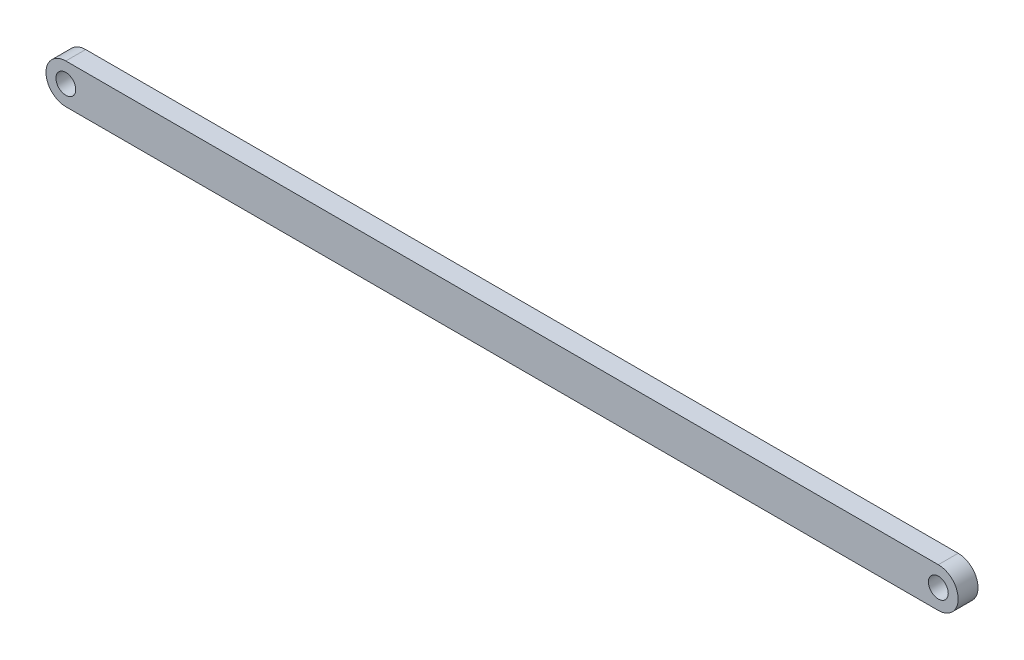
ISO-10303-21;
HEADER;
FILE_DESCRIPTION(('STEP AP214'),'2;1');
FILE_NAME('part.step','',(''),(''),'','','');
FILE_SCHEMA(('AUTOMOTIVE_DESIGN { 1 0 10303 214 1 1 1 1 }'));
ENDSEC;
DATA;
#1=APPLICATION_CONTEXT('core data for automotive mechanical design processes');
#2=APPLICATION_PROTOCOL_DEFINITION('international standard','automotive_design',2000,#1);
#3=PRODUCT_CONTEXT('',#1,'mechanical');
#4=PRODUCT('Part','Part','',(#3));
#5=PRODUCT_RELATED_PRODUCT_CATEGORY('part','',(#4));
#6=PRODUCT_DEFINITION_FORMATION('','',#4);
#7=PRODUCT_DEFINITION_CONTEXT('part definition',#1,'design');
#8=PRODUCT_DEFINITION('design','',#6,#7);
#9=PRODUCT_DEFINITION_SHAPE('','',#8);
#10=(LENGTH_UNIT() NAMED_UNIT(*) SI_UNIT(.MILLI.,.METRE.));
#11=(NAMED_UNIT(*) PLANE_ANGLE_UNIT() SI_UNIT($,.RADIAN.));
#12=(NAMED_UNIT(*) SI_UNIT($,.STERADIAN.) SOLID_ANGLE_UNIT());
#13=UNCERTAINTY_MEASURE_WITH_UNIT(LENGTH_MEASURE(1.E-05),#10,'distance_accuracy_value','');
#14=(GEOMETRIC_REPRESENTATION_CONTEXT(3) GLOBAL_UNCERTAINTY_ASSIGNED_CONTEXT((#13)) GLOBAL_UNIT_ASSIGNED_CONTEXT((#10,
#11,#12)) REPRESENTATION_CONTEXT('',''));
#15=CARTESIAN_POINT('',(0.,0.,0.));
#16=DIRECTION('',(0.,0.,1.));
#17=DIRECTION('',(1.,0.,0.));
#18=AXIS2_PLACEMENT_3D('',#15,#16,#17);
#19=CARTESIAN_POINT('',(0.,0.,5.));
#20=DIRECTION('',(0.,0.,1.));
#21=DIRECTION('',(1.,0.,0.));
#22=AXIS2_PLACEMENT_3D('',#19,#20,#21);
#23=PLANE('',#22);
#24=CARTESIAN_POINT('',(0.,0.,5.));
#25=DIRECTION('',(0.,0.,1.));
#26=DIRECTION('',(1.,0.,0.));
#27=AXIS2_PLACEMENT_3D('',#24,#25,#26);
#28=CIRCLE('',#27,2.5);
#29=CARTESIAN_POINT('',(2.5,0.,5.));
#30=VERTEX_POINT('',#29);
#31=EDGE_CURVE('E118',#30,#30,#28,.T.);
#32=ORIENTED_EDGE('',*,*,#31,.F.);
#33=EDGE_LOOP('',(#32));
#34=FACE_BOUND('',#33,.T.);
#35=CARTESIAN_POINT('',(0.,0.,5.));
#36=DIRECTION('',(0.,0.,1.));
#37=DIRECTION('',(1.,0.,0.));
#38=AXIS2_PLACEMENT_3D('',#35,#36,#37);
#39=CIRCLE('',#38,5.);
#40=CARTESIAN_POINT('',(0.,5.,5.));
#41=VERTEX_POINT('',#40);
#42=CARTESIAN_POINT('',(0.,-5.,5.));
#43=VERTEX_POINT('',#42);
#44=EDGE_CURVE('E98',#41,#43,#39,.T.);
#45=ORIENTED_EDGE('',*,*,#44,.T.);
#46=DIRECTION('',(1.,0.,0.));
#47=VECTOR('',#46,1.);
#48=CARTESIAN_POINT('',(0.,-5.,5.));
#49=LINE('',#48,#47);
#50=CARTESIAN_POINT('',(220.,-5.,5.));
#51=VERTEX_POINT('',#50);
#52=EDGE_CURVE('E93',#43,#51,#49,.T.);
#53=ORIENTED_EDGE('',*,*,#52,.T.);
#54=CARTESIAN_POINT('',(220.,0.,5.));
#55=DIRECTION('',(0.,0.,1.));
#56=DIRECTION('',(1.,0.,0.));
#57=AXIS2_PLACEMENT_3D('',#54,#55,#56);
#58=CIRCLE('',#57,5.);
#59=CARTESIAN_POINT('',(220.,5.,5.));
#60=VERTEX_POINT('',#59);
#61=EDGE_CURVE('E96',#51,#60,#58,.T.);
#62=ORIENTED_EDGE('',*,*,#61,.T.);
#63=DIRECTION('',(-1.,0.,0.));
#64=VECTOR('',#63,1.);
#65=CARTESIAN_POINT('',(0.,5.,5.));
#66=LINE('',#65,#64);
#67=EDGE_CURVE('E63',#60,#41,#66,.T.);
#68=ORIENTED_EDGE('',*,*,#67,.T.);
#69=EDGE_LOOP('',(#45,#53,#62,#68));
#70=FACE_BOUND('',#69,.T.);
#71=CARTESIAN_POINT('',(220.,0.,5.));
#72=DIRECTION('',(0.,0.,1.));
#73=DIRECTION('',(1.,0.,0.));
#74=AXIS2_PLACEMENT_3D('',#71,#72,#73);
#75=CIRCLE('',#74,2.5);
#76=CARTESIAN_POINT('',(222.5,0.,5.));
#77=VERTEX_POINT('',#76);
#78=EDGE_CURVE('E140',#77,#77,#75,.T.);
#79=ORIENTED_EDGE('',*,*,#78,.F.);
#80=EDGE_LOOP('',(#79));
#81=FACE_BOUND('',#80,.T.);
#82=ADVANCED_FACE('F45',(#34,#70,#81),#23,.T.);
#83=CARTESIAN_POINT('',(0.,0.,0.));
#84=DIRECTION('',(0.,0.,1.));
#85=DIRECTION('',(1.,0.,0.));
#86=AXIS2_PLACEMENT_3D('',#83,#84,#85);
#87=PLANE('',#86);
#88=CARTESIAN_POINT('',(0.,0.,0.));
#89=DIRECTION('',(0.,0.,1.));
#90=DIRECTION('',(1.,0.,0.));
#91=AXIS2_PLACEMENT_3D('',#88,#89,#90);
#92=CIRCLE('',#91,5.);
#93=CARTESIAN_POINT('',(0.,5.,0.));
#94=VERTEX_POINT('',#93);
#95=CARTESIAN_POINT('',(0.,-5.,0.));
#96=VERTEX_POINT('',#95);
#97=EDGE_CURVE('E114',#94,#96,#92,.T.);
#98=ORIENTED_EDGE('',*,*,#97,.F.);
#99=DIRECTION('',(-1.,0.,0.));
#100=VECTOR('',#99,1.);
#101=CARTESIAN_POINT('',(0.,5.,0.));
#102=LINE('',#101,#100);
#103=CARTESIAN_POINT('',(220.,5.,0.));
#104=VERTEX_POINT('',#103);
#105=EDGE_CURVE('E86',#104,#94,#102,.T.);
#106=ORIENTED_EDGE('',*,*,#105,.F.);
#107=CARTESIAN_POINT('',(220.,0.,0.));
#108=DIRECTION('',(0.,0.,1.));
#109=DIRECTION('',(1.,0.,0.));
#110=AXIS2_PLACEMENT_3D('',#107,#108,#109);
#111=CIRCLE('',#110,5.);
#112=CARTESIAN_POINT('',(220.,-5.,0.));
#113=VERTEX_POINT('',#112);
#114=EDGE_CURVE('E80',#113,#104,#111,.T.);
#115=ORIENTED_EDGE('',*,*,#114,.F.);
#116=DIRECTION('',(1.,0.,0.));
#117=VECTOR('',#116,1.);
#118=CARTESIAN_POINT('',(0.,-5.,0.));
#119=LINE('',#118,#117);
#120=EDGE_CURVE('E103',#96,#113,#119,.T.);
#121=ORIENTED_EDGE('',*,*,#120,.F.);
#122=EDGE_LOOP('',(#98,#106,#115,#121));
#123=FACE_BOUND('',#122,.T.);
#124=CARTESIAN_POINT('',(0.,0.,0.));
#125=DIRECTION('',(0.,0.,1.));
#126=DIRECTION('',(1.,0.,0.));
#127=AXIS2_PLACEMENT_3D('',#124,#125,#126);
#128=CIRCLE('',#127,2.5);
#129=CARTESIAN_POINT('',(2.5,0.,0.));
#130=VERTEX_POINT('',#129);
#131=EDGE_CURVE('E136',#130,#130,#128,.T.);
#132=ORIENTED_EDGE('',*,*,#131,.T.);
#133=EDGE_LOOP('',(#132));
#134=FACE_BOUND('',#133,.T.);
#135=CARTESIAN_POINT('',(220.,0.,0.));
#136=DIRECTION('',(0.,0.,1.));
#137=DIRECTION('',(1.,0.,0.));
#138=AXIS2_PLACEMENT_3D('',#135,#136,#137);
#139=CIRCLE('',#138,2.5);
#140=CARTESIAN_POINT('',(222.5,0.,0.));
#141=VERTEX_POINT('',#140);
#142=EDGE_CURVE('E144',#141,#141,#139,.T.);
#143=ORIENTED_EDGE('',*,*,#142,.T.);
#144=EDGE_LOOP('',(#143));
#145=FACE_BOUND('',#144,.T.);
#146=ADVANCED_FACE('F131',(#123,#134,#145),#87,.F.);
#147=CARTESIAN_POINT('',(0.,0.,5.));
#148=DIRECTION('',(0.,0.,-1.));
#149=DIRECTION('',(-1.,0.,0.));
#150=AXIS2_PLACEMENT_3D('',#147,#148,#149);
#151=CYLINDRICAL_SURFACE('',#150,5.);
#152=ORIENTED_EDGE('',*,*,#97,.T.);
#153=DIRECTION('',(0.,0.,-1.));
#154=VECTOR('',#153,1.);
#155=CARTESIAN_POINT('',(0.,-5.,5.));
#156=LINE('',#155,#154);
#157=EDGE_CURVE('E11',#43,#96,#156,.T.);
#158=ORIENTED_EDGE('',*,*,#157,.F.);
#159=ORIENTED_EDGE('',*,*,#44,.F.);
#160=DIRECTION('',(0.,0.,-1.));
#161=VECTOR('',#160,1.);
#162=CARTESIAN_POINT('',(0.,5.,5.));
#163=LINE('',#162,#161);
#164=EDGE_CURVE('E110',#41,#94,#163,.T.);
#165=ORIENTED_EDGE('',*,*,#164,.T.);
#166=EDGE_LOOP('',(#152,#158,#159,#165));
#167=FACE_BOUND('',#166,.T.);
#168=ADVANCED_FACE('F47',(#167),#151,.T.);
#169=CARTESIAN_POINT('',(0.,-5.,5.));
#170=DIRECTION('',(0.,1.,0.));
#171=DIRECTION('',(0.,0.,1.));
#172=AXIS2_PLACEMENT_3D('',#169,#170,#171);
#173=PLANE('',#172);
#174=ORIENTED_EDGE('',*,*,#120,.T.);
#175=DIRECTION('',(0.,0.,-1.));
#176=VECTOR('',#175,1.);
#177=CARTESIAN_POINT('',(220.,-5.,5.));
#178=LINE('',#177,#176);
#179=EDGE_CURVE('E55',#51,#113,#178,.T.);
#180=ORIENTED_EDGE('',*,*,#179,.F.);
#181=ORIENTED_EDGE('',*,*,#52,.F.);
#182=ORIENTED_EDGE('',*,*,#157,.T.);
#183=EDGE_LOOP('',(#174,#180,#181,#182));
#184=FACE_BOUND('',#183,.T.);
#185=ADVANCED_FACE('F102',(#184),#173,.F.);
#186=CARTESIAN_POINT('',(220.,0.,5.));
#187=DIRECTION('',(0.,0.,-1.));
#188=DIRECTION('',(-1.,0.,0.));
#189=AXIS2_PLACEMENT_3D('',#186,#187,#188);
#190=CYLINDRICAL_SURFACE('',#189,5.);
#191=ORIENTED_EDGE('',*,*,#114,.T.);
#192=DIRECTION('',(0.,0.,-1.));
#193=VECTOR('',#192,1.);
#194=CARTESIAN_POINT('',(220.,5.,5.));
#195=LINE('',#194,#193);
#196=EDGE_CURVE('E105',#60,#104,#195,.T.);
#197=ORIENTED_EDGE('',*,*,#196,.F.);
#198=ORIENTED_EDGE('',*,*,#61,.F.);
#199=ORIENTED_EDGE('',*,*,#179,.T.);
#200=EDGE_LOOP('',(#191,#197,#198,#199));
#201=FACE_BOUND('',#200,.T.);
#202=ADVANCED_FACE('F106',(#201),#190,.T.);
#203=CARTESIAN_POINT('',(0.,5.,5.));
#204=DIRECTION('',(0.,-1.,0.));
#205=DIRECTION('',(0.,0.,-1.));
#206=AXIS2_PLACEMENT_3D('',#203,#204,#205);
#207=PLANE('',#206);
#208=ORIENTED_EDGE('',*,*,#105,.T.);
#209=ORIENTED_EDGE('',*,*,#164,.F.);
#210=ORIENTED_EDGE('',*,*,#67,.F.);
#211=ORIENTED_EDGE('',*,*,#196,.T.);
#212=EDGE_LOOP('',(#208,#209,#210,#211));
#213=FACE_BOUND('',#212,.T.);
#214=ADVANCED_FACE('F128',(#213),#207,.F.);
#215=CARTESIAN_POINT('',(0.,0.,5.));
#216=DIRECTION('',(0.,0.,-1.));
#217=DIRECTION('',(-1.,0.,0.));
#218=AXIS2_PLACEMENT_3D('',#215,#216,#217);
#219=CYLINDRICAL_SURFACE('',#218,2.5);
#220=ORIENTED_EDGE('',*,*,#31,.T.);
#221=EDGE_LOOP('',(#220));
#222=FACE_BOUND('',#221,.T.);
#223=ORIENTED_EDGE('',*,*,#131,.F.);
#224=EDGE_LOOP('',(#223));
#225=FACE_BOUND('',#224,.T.);
#226=ADVANCED_FACE('F163',(#222,#225),#219,.F.);
#227=CARTESIAN_POINT('',(220.,0.,5.));
#228=DIRECTION('',(0.,0.,-1.));
#229=DIRECTION('',(-1.,0.,0.));
#230=AXIS2_PLACEMENT_3D('',#227,#228,#229);
#231=CYLINDRICAL_SURFACE('',#230,2.5);
#232=ORIENTED_EDGE('',*,*,#78,.T.);
#233=EDGE_LOOP('',(#232));
#234=FACE_BOUND('',#233,.T.);
#235=ORIENTED_EDGE('',*,*,#142,.F.);
#236=EDGE_LOOP('',(#235));
#237=FACE_BOUND('',#236,.T.);
#238=ADVANCED_FACE('F152',(#234,#237),#231,.F.);
#239=CLOSED_SHELL('',(#82,#146,#168,#185,#202,#214,#226,#238));
#240=MANIFOLD_SOLID_BREP('B2',#239);
#241=ADVANCED_BREP_SHAPE_REPRESENTATION('',(#18,#240),#14);
#242=SHAPE_DEFINITION_REPRESENTATION(#9,#241);
ENDSEC;
END-ISO-10303-21;
